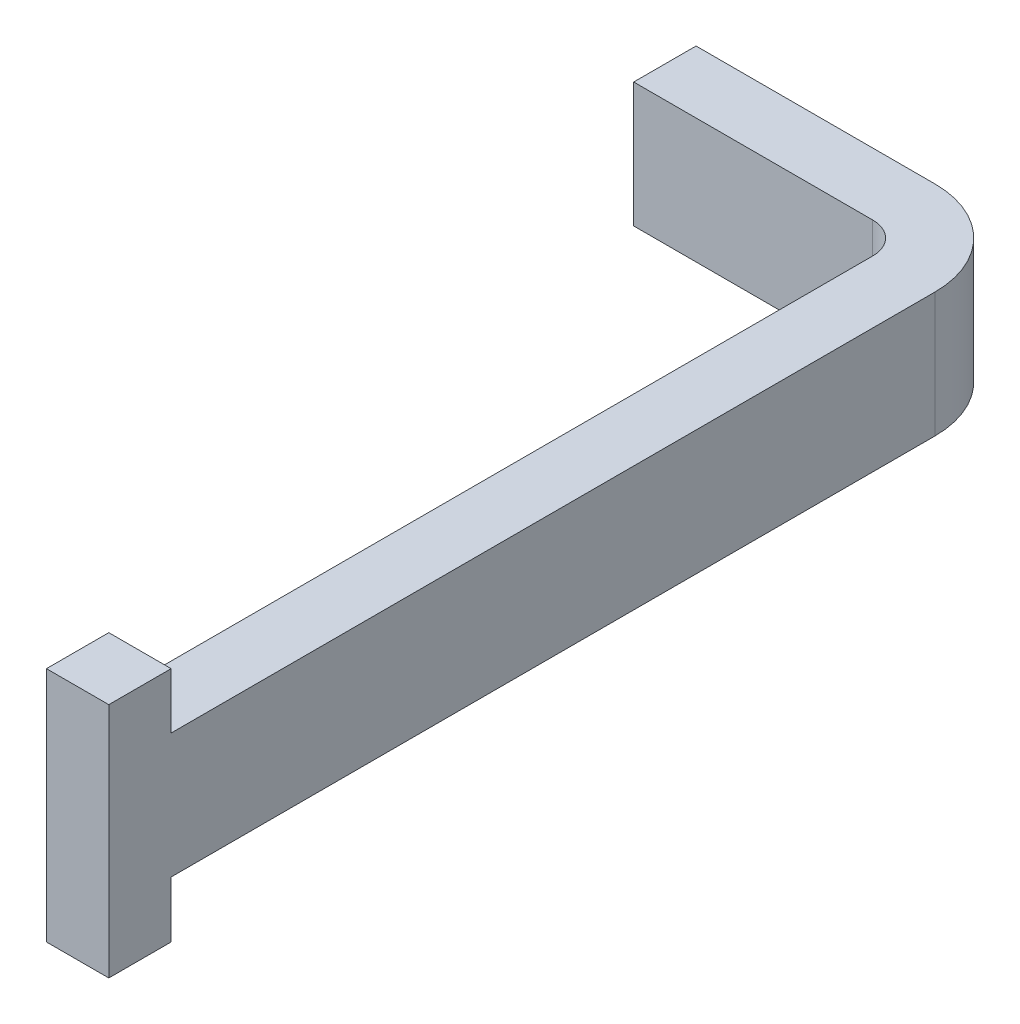
ISO-10303-21;
HEADER;
FILE_DESCRIPTION(('STEP AP214'),'2;1');
FILE_NAME('part.step','',(''),(''),'','','');
FILE_SCHEMA(('AUTOMOTIVE_DESIGN { 1 0 10303 214 1 1 1 1 }'));
ENDSEC;
DATA;
#1=APPLICATION_CONTEXT('core data for automotive mechanical design processes');
#2=APPLICATION_PROTOCOL_DEFINITION('international standard','automotive_design',2000,#1);
#3=PRODUCT_CONTEXT('',#1,'mechanical');
#4=PRODUCT('Part','Part','',(#3));
#5=PRODUCT_RELATED_PRODUCT_CATEGORY('part','',(#4));
#6=PRODUCT_DEFINITION_FORMATION('','',#4);
#7=PRODUCT_DEFINITION_CONTEXT('part definition',#1,'design');
#8=PRODUCT_DEFINITION('design','',#6,#7);
#9=PRODUCT_DEFINITION_SHAPE('','',#8);
#10=(LENGTH_UNIT() NAMED_UNIT(*) SI_UNIT(.MILLI.,.METRE.));
#11=(NAMED_UNIT(*) PLANE_ANGLE_UNIT() SI_UNIT($,.RADIAN.));
#12=(NAMED_UNIT(*) SI_UNIT($,.STERADIAN.) SOLID_ANGLE_UNIT());
#13=UNCERTAINTY_MEASURE_WITH_UNIT(LENGTH_MEASURE(1.E-05),#10,'distance_accuracy_value','');
#14=(GEOMETRIC_REPRESENTATION_CONTEXT(3) GLOBAL_UNCERTAINTY_ASSIGNED_CONTEXT((#13)) GLOBAL_UNIT_ASSIGNED_CONTEXT((#10,
#11,#12)) REPRESENTATION_CONTEXT('',''));
#15=CARTESIAN_POINT('',(0.,0.,0.));
#16=DIRECTION('',(0.,0.,1.));
#17=DIRECTION('',(1.,0.,0.));
#18=AXIS2_PLACEMENT_3D('',#15,#16,#17);
#19=CARTESIAN_POINT('',(-2.66645064696626,3.46679955703211,0.));
#20=DIRECTION('',(1.,0.,0.));
#21=DIRECTION('',(0.,1.,0.));
#22=AXIS2_PLACEMENT_3D('',#19,#20,#21);
#23=PLANE('',#22);
#24=DIRECTION('',(0.,0.,-1.));
#25=VECTOR('',#24,1.);
#26=CARTESIAN_POINT('',(-2.66645064696626,3.19594797890523,4.42580273563157));
#27=LINE('',#26,#25);
#28=CARTESIAN_POINT('',(-2.66645064696626,3.19594797890523,4.12580273563157));
#29=VERTEX_POINT('',#28);
#30=CARTESIAN_POINT('',(-2.66645064696626,3.19594797890523,4.42580273563157));
#31=VERTEX_POINT('',#30);
#32=EDGE_CURVE('E206',#29,#31,#27,.F.);
#33=ORIENTED_EDGE('',*,*,#32,.F.);
#34=DIRECTION('',(0.,1.,0.));
#35=VECTOR('',#34,1.);
#36=CARTESIAN_POINT('',(-2.66645064696626,3.46679955703211,4.12580273563157));
#37=LINE('',#36,#35);
#38=CARTESIAN_POINT('',(-2.66645064696626,3.46679955703211,4.12580273563157));
#39=VERTEX_POINT('',#38);
#40=EDGE_CURVE('E196',#39,#29,#37,.F.);
#41=ORIENTED_EDGE('',*,*,#40,.F.);
#42=DIRECTION('',(0.,0.,-1.));
#43=VECTOR('',#42,1.);
#44=CARTESIAN_POINT('',(-2.66645064696626,3.46679955703211,4.12580273563157));
#45=LINE('',#44,#43);
#46=CARTESIAN_POINT('',(-2.66645064696626,3.46679955703211,0.450000000000026));
#47=VERTEX_POINT('',#46);
#48=EDGE_CURVE('E178',#47,#39,#45,.F.);
#49=ORIENTED_EDGE('',*,*,#48,.F.);
#50=DIRECTION('',(0.,-1.,0.));
#51=VECTOR('',#50,1.);
#52=CARTESIAN_POINT('',(-2.66645064696626,4.06679955703211,0.450000000000026));
#53=LINE('',#52,#51);
#54=CARTESIAN_POINT('',(-2.66645064696626,4.06679955703211,0.450000000000026));
#55=VERTEX_POINT('',#54);
#56=EDGE_CURVE('E242',#55,#47,#53,.T.);
#57=ORIENTED_EDGE('',*,*,#56,.F.);
#58=DIRECTION('',(0.,0.,1.));
#59=VECTOR('',#58,1.);
#60=CARTESIAN_POINT('',(-2.66645064696626,4.06679955703211,4.12580273563157));
#61=LINE('',#60,#59);
#62=CARTESIAN_POINT('',(-2.66645064696626,4.06679955703211,4.12580273563157));
#63=VERTEX_POINT('',#62);
#64=EDGE_CURVE('E148',#63,#55,#61,.F.);
#65=ORIENTED_EDGE('',*,*,#64,.F.);
#66=DIRECTION('',(0.,1.,0.));
#67=VECTOR('',#66,1.);
#68=CARTESIAN_POINT('',(-2.66645064696626,4.33505285325489,4.12580273563157));
#69=LINE('',#68,#67);
#70=CARTESIAN_POINT('',(-2.66645064696626,4.33505285325489,4.12580273563157));
#71=VERTEX_POINT('',#70);
#72=EDGE_CURVE('E227',#71,#63,#69,.F.);
#73=ORIENTED_EDGE('',*,*,#72,.F.);
#74=DIRECTION('',(0.,0.,1.));
#75=VECTOR('',#74,1.);
#76=CARTESIAN_POINT('',(-2.66645064696626,4.33505285325489,4.42580273563157));
#77=LINE('',#76,#75);
#78=CARTESIAN_POINT('',(-2.66645064696626,4.33505285325489,4.42580273563157));
#79=VERTEX_POINT('',#78);
#80=EDGE_CURVE('E224',#79,#71,#77,.F.);
#81=ORIENTED_EDGE('',*,*,#80,.F.);
#82=DIRECTION('',(0.,1.,0.));
#83=VECTOR('',#82,1.);
#84=CARTESIAN_POINT('',(-2.66645064696626,4.33505285325489,4.42580273563157));
#85=LINE('',#84,#83);
#86=EDGE_CURVE('E215',#31,#79,#85,.T.);
#87=ORIENTED_EDGE('',*,*,#86,.F.);
#88=EDGE_LOOP('',(#33,#41,#49,#57,#65,#73,#81,#87));
#89=FACE_BOUND('',#88,.T.);
#90=ADVANCED_FACE('F17',(#89),#23,.T.);
#91=CARTESIAN_POINT('',(-3.11645064696626,4.06679955703211,0.450000000000026));
#92=DIRECTION('',(0.,-1.,0.));
#93=DIRECTION('',(1.,0.,0.));
#94=AXIS2_PLACEMENT_3D('',#91,#92,#93);
#95=CYLINDRICAL_SURFACE('',#94,0.45);
#96=CARTESIAN_POINT('',(-3.11645064696626,3.46679955703211,0.450000000000026));
#97=DIRECTION('',(0.,-1.,0.));
#98=DIRECTION('',(1.,0.,0.));
#99=AXIS2_PLACEMENT_3D('',#96,#97,#98);
#100=CIRCLE('',#99,0.45);
#101=CARTESIAN_POINT('',(-3.11645064696626,3.46679955703211,0.));
#102=VERTEX_POINT('',#101);
#103=EDGE_CURVE('E20',#102,#47,#100,.T.);
#104=ORIENTED_EDGE('',*,*,#103,.F.);
#105=DIRECTION('',(0.,1.,0.));
#106=VECTOR('',#105,1.);
#107=CARTESIAN_POINT('',(-3.11645064696626,4.06679955703211,0.));
#108=LINE('',#107,#106);
#109=CARTESIAN_POINT('',(-3.11645064696626,4.06679955703211,0.));
#110=VERTEX_POINT('',#109);
#111=EDGE_CURVE('E61',#110,#102,#108,.F.);
#112=ORIENTED_EDGE('',*,*,#111,.F.);
#113=CARTESIAN_POINT('',(-3.11645064696626,4.06679955703211,0.450000000000026));
#114=DIRECTION('',(0.,-1.,0.));
#115=DIRECTION('',(1.,0.,0.));
#116=AXIS2_PLACEMENT_3D('',#113,#114,#115);
#117=CIRCLE('',#116,0.45);
#118=EDGE_CURVE('E146',#55,#110,#117,.F.);
#119=ORIENTED_EDGE('',*,*,#118,.F.);
#120=ORIENTED_EDGE('',*,*,#56,.T.);
#121=EDGE_LOOP('',(#104,#112,#119,#120));
#122=FACE_BOUND('',#121,.T.);
#123=ADVANCED_FACE('F287',(#122),#95,.T.);
#124=CARTESIAN_POINT('',(-2.66645064696626,4.06679955703211,0.));
#125=DIRECTION('',(0.,0.,-1.));
#126=DIRECTION('',(0.,1.,0.));
#127=AXIS2_PLACEMENT_3D('',#124,#125,#126);
#128=PLANE('',#127);
#129=DIRECTION('',(1.,0.,0.));
#130=VECTOR('',#129,1.);
#131=CARTESIAN_POINT('',(-2.66645064696626,3.46679955703211,0.));
#132=LINE('',#131,#130);
#133=CARTESIAN_POINT('',(-4.26645064696626,3.46679955703211,0.));
#134=VERTEX_POINT('',#133);
#135=EDGE_CURVE('E182',#134,#102,#132,.T.);
#136=ORIENTED_EDGE('',*,*,#135,.F.);
#137=DIRECTION('',(0.,1.,0.));
#138=VECTOR('',#137,1.);
#139=CARTESIAN_POINT('',(-4.26645064696626,3.46679955703211,0.));
#140=LINE('',#139,#138);
#141=CARTESIAN_POINT('',(-4.26645064696626,4.06679955703211,0.));
#142=VERTEX_POINT('',#141);
#143=EDGE_CURVE('E71',#134,#142,#140,.T.);
#144=ORIENTED_EDGE('',*,*,#143,.T.);
#145=DIRECTION('',(1.,0.,0.));
#146=VECTOR('',#145,1.);
#147=CARTESIAN_POINT('',(-2.66645064696626,4.06679955703211,0.));
#148=LINE('',#147,#146);
#149=EDGE_CURVE('E147',#110,#142,#148,.F.);
#150=ORIENTED_EDGE('',*,*,#149,.F.);
#151=ORIENTED_EDGE('',*,*,#111,.T.);
#152=EDGE_LOOP('',(#136,#144,#150,#151));
#153=FACE_BOUND('',#152,.T.);
#154=ADVANCED_FACE('F288',(#153),#128,.T.);
#155=CARTESIAN_POINT('',(-4.26645064696626,3.46679955703211,0.3));
#156=DIRECTION('',(1.,0.,0.));
#157=DIRECTION('',(0.,0.,-1.));
#158=AXIS2_PLACEMENT_3D('',#155,#156,#157);
#159=PLANE('',#158);
#160=DIRECTION('',(0.,0.,1.));
#161=VECTOR('',#160,1.);
#162=CARTESIAN_POINT('',(-4.26645064696626,4.06679955703211,4.12580273563157));
#163=LINE('',#162,#161);
#164=CARTESIAN_POINT('',(-4.26645064696626,4.06679955703211,0.3));
#165=VERTEX_POINT('',#164);
#166=EDGE_CURVE('E121',#142,#165,#163,.T.);
#167=ORIENTED_EDGE('',*,*,#166,.F.);
#168=ORIENTED_EDGE('',*,*,#143,.F.);
#169=DIRECTION('',(0.,0.,-1.));
#170=VECTOR('',#169,1.);
#171=CARTESIAN_POINT('',(-4.26645064696626,3.46679955703211,4.12580273563157));
#172=LINE('',#171,#170);
#173=CARTESIAN_POINT('',(-4.26645064696626,3.46679955703211,0.3));
#174=VERTEX_POINT('',#173);
#175=EDGE_CURVE('E133',#174,#134,#172,.T.);
#176=ORIENTED_EDGE('',*,*,#175,.F.);
#177=DIRECTION('',(0.,1.,0.));
#178=VECTOR('',#177,1.);
#179=CARTESIAN_POINT('',(-4.26645064696626,4.06679955703211,0.3));
#180=LINE('',#179,#178);
#181=EDGE_CURVE('E229',#174,#165,#180,.T.);
#182=ORIENTED_EDGE('',*,*,#181,.T.);
#183=EDGE_LOOP('',(#167,#168,#176,#182));
#184=FACE_BOUND('',#183,.T.);
#185=ADVANCED_FACE('F289',(#184),#159,.F.);
#186=CARTESIAN_POINT('',(-4.26645064696626,4.06679955703211,0.3));
#187=DIRECTION('',(0.,0.,-1.));
#188=DIRECTION('',(-1.,0.,0.));
#189=AXIS2_PLACEMENT_3D('',#186,#187,#188);
#190=PLANE('',#189);
#191=DIRECTION('',(0.,-1.,0.));
#192=VECTOR('',#191,1.);
#193=CARTESIAN_POINT('',(-3.11645064696626,4.06679955703211,0.3));
#194=LINE('',#193,#192);
#195=CARTESIAN_POINT('',(-3.11645064696626,3.46679955703211,0.3));
#196=VERTEX_POINT('',#195);
#197=CARTESIAN_POINT('',(-3.11645064696626,4.06679955703211,0.3));
#198=VERTEX_POINT('',#197);
#199=EDGE_CURVE('E126',#196,#198,#194,.F.);
#200=ORIENTED_EDGE('',*,*,#199,.T.);
#201=DIRECTION('',(1.,0.,0.));
#202=VECTOR('',#201,1.);
#203=CARTESIAN_POINT('',(-2.66645064696626,4.06679955703211,0.3));
#204=LINE('',#203,#202);
#205=EDGE_CURVE('E118',#165,#198,#204,.T.);
#206=ORIENTED_EDGE('',*,*,#205,.F.);
#207=ORIENTED_EDGE('',*,*,#181,.F.);
#208=DIRECTION('',(1.,0.,0.));
#209=VECTOR('',#208,1.);
#210=CARTESIAN_POINT('',(-2.66645064696626,3.46679955703211,0.3));
#211=LINE('',#210,#209);
#212=EDGE_CURVE('E129',#196,#174,#211,.F.);
#213=ORIENTED_EDGE('',*,*,#212,.F.);
#214=EDGE_LOOP('',(#200,#206,#207,#213));
#215=FACE_BOUND('',#214,.T.);
#216=ADVANCED_FACE('F127',(#215),#190,.F.);
#217=CARTESIAN_POINT('',(-2.66645064696626,4.33505285325489,4.12580273563157));
#218=DIRECTION('',(0.,0.,-1.));
#219=DIRECTION('',(-1.,0.,0.));
#220=AXIS2_PLACEMENT_3D('',#217,#218,#219);
#221=PLANE('',#220);
#222=ORIENTED_EDGE('',*,*,#72,.T.);
#223=DIRECTION('',(1.,0.,0.));
#224=VECTOR('',#223,1.);
#225=CARTESIAN_POINT('',(-2.66645064696626,4.06679955703211,4.12580273563157));
#226=LINE('',#225,#224);
#227=CARTESIAN_POINT('',(-2.96645064696626,4.06679955703211,4.12580273563157));
#228=VERTEX_POINT('',#227);
#229=EDGE_CURVE('E138',#228,#63,#226,.T.);
#230=ORIENTED_EDGE('',*,*,#229,.F.);
#231=DIRECTION('',(0.,1.,0.));
#232=VECTOR('',#231,1.);
#233=CARTESIAN_POINT('',(-2.96645064696626,3.46679955703211,4.12580273563157));
#234=LINE('',#233,#232);
#235=CARTESIAN_POINT('',(-2.96645064696626,4.33505285325489,4.12580273563157));
#236=VERTEX_POINT('',#235);
#237=EDGE_CURVE('E115',#228,#236,#234,.T.);
#238=ORIENTED_EDGE('',*,*,#237,.T.);
#239=DIRECTION('',(-1.,0.,0.));
#240=VECTOR('',#239,1.);
#241=CARTESIAN_POINT('',(-2.66645064696626,4.33505285325489,4.12580273563157));
#242=LINE('',#241,#240);
#243=EDGE_CURVE('E222',#71,#236,#242,.T.);
#244=ORIENTED_EDGE('',*,*,#243,.F.);
#245=EDGE_LOOP('',(#222,#230,#238,#244));
#246=FACE_BOUND('',#245,.T.);
#247=ADVANCED_FACE('F265',(#246),#221,.T.);
#248=CARTESIAN_POINT('',(-2.66645064696626,4.33505285325489,4.42580273563157));
#249=DIRECTION('',(0.,1.,0.));
#250=DIRECTION('',(-1.,0.,0.));
#251=AXIS2_PLACEMENT_3D('',#248,#249,#250);
#252=PLANE('',#251);
#253=ORIENTED_EDGE('',*,*,#80,.T.);
#254=ORIENTED_EDGE('',*,*,#243,.T.);
#255=DIRECTION('',(0.,0.,1.));
#256=VECTOR('',#255,1.);
#257=CARTESIAN_POINT('',(-2.96645064696626,4.33505285325489,0.));
#258=LINE('',#257,#256);
#259=CARTESIAN_POINT('',(-2.96645064696626,4.33505285325489,4.42580273563157));
#260=VERTEX_POINT('',#259);
#261=EDGE_CURVE('E167',#236,#260,#258,.T.);
#262=ORIENTED_EDGE('',*,*,#261,.T.);
#263=DIRECTION('',(1.,0.,0.));
#264=VECTOR('',#263,1.);
#265=CARTESIAN_POINT('',(-2.66645064696626,4.33505285325489,4.42580273563157));
#266=LINE('',#265,#264);
#267=EDGE_CURVE('E213',#79,#260,#266,.F.);
#268=ORIENTED_EDGE('',*,*,#267,.F.);
#269=EDGE_LOOP('',(#253,#254,#262,#268));
#270=FACE_BOUND('',#269,.T.);
#271=ADVANCED_FACE('F259',(#270),#252,.T.);
#272=CARTESIAN_POINT('',(-2.66645064696626,4.33505285325489,4.42580273563157));
#273=DIRECTION('',(0.,0.,1.));
#274=DIRECTION('',(1.,0.,0.));
#275=AXIS2_PLACEMENT_3D('',#272,#273,#274);
#276=PLANE('',#275);
#277=ORIENTED_EDGE('',*,*,#86,.T.);
#278=ORIENTED_EDGE('',*,*,#267,.T.);
#279=DIRECTION('',(0.,1.,0.));
#280=VECTOR('',#279,1.);
#281=CARTESIAN_POINT('',(-2.96645064696626,3.46679955703211,4.42580273563157));
#282=LINE('',#281,#280);
#283=CARTESIAN_POINT('',(-2.96645064696626,3.19594797890523,4.42580273563157));
#284=VERTEX_POINT('',#283);
#285=EDGE_CURVE('E201',#260,#284,#282,.F.);
#286=ORIENTED_EDGE('',*,*,#285,.T.);
#287=DIRECTION('',(1.,0.,0.));
#288=VECTOR('',#287,1.);
#289=CARTESIAN_POINT('',(-2.66645064696626,3.19594797890523,4.42580273563157));
#290=LINE('',#289,#288);
#291=EDGE_CURVE('E204',#31,#284,#290,.F.);
#292=ORIENTED_EDGE('',*,*,#291,.F.);
#293=EDGE_LOOP('',(#277,#278,#286,#292));
#294=FACE_BOUND('',#293,.T.);
#295=ADVANCED_FACE('F283',(#294),#276,.T.);
#296=CARTESIAN_POINT('',(-2.66645064696626,3.19594797890523,4.42580273563157));
#297=DIRECTION('',(0.,-1.,0.));
#298=DIRECTION('',(0.,0.,-1.));
#299=AXIS2_PLACEMENT_3D('',#296,#297,#298);
#300=PLANE('',#299);
#301=ORIENTED_EDGE('',*,*,#32,.T.);
#302=ORIENTED_EDGE('',*,*,#291,.T.);
#303=DIRECTION('',(0.,0.,1.));
#304=VECTOR('',#303,1.);
#305=CARTESIAN_POINT('',(-2.96645064696626,3.19594797890523,0.));
#306=LINE('',#305,#304);
#307=CARTESIAN_POINT('',(-2.96645064696626,3.19594797890523,4.12580273563157));
#308=VERTEX_POINT('',#307);
#309=EDGE_CURVE('E192',#284,#308,#306,.F.);
#310=ORIENTED_EDGE('',*,*,#309,.T.);
#311=DIRECTION('',(-1.,0.,0.));
#312=VECTOR('',#311,1.);
#313=CARTESIAN_POINT('',(-2.66645064696626,3.19594797890523,4.12580273563157));
#314=LINE('',#313,#312);
#315=EDGE_CURVE('E184',#29,#308,#314,.T.);
#316=ORIENTED_EDGE('',*,*,#315,.F.);
#317=EDGE_LOOP('',(#301,#302,#310,#316));
#318=FACE_BOUND('',#317,.T.);
#319=ADVANCED_FACE('F280',(#318),#300,.T.);
#320=CARTESIAN_POINT('',(-2.66645064696626,3.46679955703211,4.12580273563157));
#321=DIRECTION('',(0.,0.,-1.));
#322=DIRECTION('',(-1.,0.,0.));
#323=AXIS2_PLACEMENT_3D('',#320,#321,#322);
#324=PLANE('',#323);
#325=ORIENTED_EDGE('',*,*,#40,.T.);
#326=ORIENTED_EDGE('',*,*,#315,.T.);
#327=DIRECTION('',(0.,1.,0.));
#328=VECTOR('',#327,1.);
#329=CARTESIAN_POINT('',(-2.96645064696626,3.46679955703211,4.12580273563157));
#330=LINE('',#329,#328);
#331=CARTESIAN_POINT('',(-2.96645064696626,3.46679955703211,4.12580273563157));
#332=VERTEX_POINT('',#331);
#333=EDGE_CURVE('E171',#308,#332,#330,.T.);
#334=ORIENTED_EDGE('',*,*,#333,.T.);
#335=DIRECTION('',(1.,0.,0.));
#336=VECTOR('',#335,1.);
#337=CARTESIAN_POINT('',(-2.66645064696626,3.46679955703211,4.12580273563157));
#338=LINE('',#337,#336);
#339=EDGE_CURVE('E175',#39,#332,#338,.F.);
#340=ORIENTED_EDGE('',*,*,#339,.F.);
#341=EDGE_LOOP('',(#325,#326,#334,#340));
#342=FACE_BOUND('',#341,.T.);
#343=ADVANCED_FACE('F275',(#342),#324,.T.);
#344=CARTESIAN_POINT('',(-2.66645064696626,3.46679955703211,4.12580273563157));
#345=DIRECTION('',(0.,-1.,0.));
#346=DIRECTION('',(0.,0.,-1.));
#347=AXIS2_PLACEMENT_3D('',#344,#345,#346);
#348=PLANE('',#347);
#349=ORIENTED_EDGE('',*,*,#212,.T.);
#350=ORIENTED_EDGE('',*,*,#175,.T.);
#351=ORIENTED_EDGE('',*,*,#135,.T.);
#352=ORIENTED_EDGE('',*,*,#103,.T.);
#353=ORIENTED_EDGE('',*,*,#48,.T.);
#354=ORIENTED_EDGE('',*,*,#339,.T.);
#355=DIRECTION('',(0.,0.,1.));
#356=VECTOR('',#355,1.);
#357=CARTESIAN_POINT('',(-2.96645064696626,3.46679955703211,0.));
#358=LINE('',#357,#356);
#359=CARTESIAN_POINT('',(-2.96645064696626,3.46679955703211,0.45));
#360=VERTEX_POINT('',#359);
#361=EDGE_CURVE('E160',#332,#360,#358,.F.);
#362=ORIENTED_EDGE('',*,*,#361,.T.);
#363=CARTESIAN_POINT('',(-3.11645064696626,3.46679955703211,0.45));
#364=DIRECTION('',(0.,-1.,0.));
#365=DIRECTION('',(1.,0.,0.));
#366=AXIS2_PLACEMENT_3D('',#363,#364,#365);
#367=CIRCLE('',#366,0.15);
#368=EDGE_CURVE('E132',#360,#196,#367,.F.);
#369=ORIENTED_EDGE('',*,*,#368,.T.);
#370=EDGE_LOOP('',(#349,#350,#351,#352,#353,#354,#362,#369));
#371=FACE_BOUND('',#370,.T.);
#372=ADVANCED_FACE('F269',(#371),#348,.T.);
#373=CARTESIAN_POINT('',(-3.11645064696626,4.06679955703211,0.45));
#374=DIRECTION('',(0.,-1.,0.));
#375=DIRECTION('',(1.,0.,0.));
#376=AXIS2_PLACEMENT_3D('',#373,#374,#375);
#377=CYLINDRICAL_SURFACE('',#376,0.15);
#378=DIRECTION('',(0.,1.,0.));
#379=VECTOR('',#378,1.);
#380=CARTESIAN_POINT('',(-2.96645064696626,3.46679955703211,0.45));
#381=LINE('',#380,#379);
#382=CARTESIAN_POINT('',(-2.96645064696626,4.06679955703211,0.45));
#383=VERTEX_POINT('',#382);
#384=EDGE_CURVE('E26',#360,#383,#381,.T.);
#385=ORIENTED_EDGE('',*,*,#384,.T.);
#386=CARTESIAN_POINT('',(-3.11645064696626,4.06679955703211,0.45));
#387=DIRECTION('',(0.,-1.,0.));
#388=DIRECTION('',(1.,0.,0.));
#389=AXIS2_PLACEMENT_3D('',#386,#387,#388);
#390=CIRCLE('',#389,0.15);
#391=EDGE_CURVE('E34',#198,#383,#390,.T.);
#392=ORIENTED_EDGE('',*,*,#391,.F.);
#393=ORIENTED_EDGE('',*,*,#199,.F.);
#394=ORIENTED_EDGE('',*,*,#368,.F.);
#395=EDGE_LOOP('',(#385,#392,#393,#394));
#396=FACE_BOUND('',#395,.T.);
#397=ADVANCED_FACE('F136',(#396),#377,.F.);
#398=CARTESIAN_POINT('',(-2.66645064696626,4.06679955703211,4.12580273563157));
#399=DIRECTION('',(0.,1.,0.));
#400=DIRECTION('',(0.,0.,1.));
#401=AXIS2_PLACEMENT_3D('',#398,#399,#400);
#402=PLANE('',#401);
#403=DIRECTION('',(0.,0.,1.));
#404=VECTOR('',#403,1.);
#405=CARTESIAN_POINT('',(-2.96645064696626,4.06679955703211,0.));
#406=LINE('',#405,#404);
#407=EDGE_CURVE('E11',#383,#228,#406,.T.);
#408=ORIENTED_EDGE('',*,*,#407,.T.);
#409=ORIENTED_EDGE('',*,*,#229,.T.);
#410=ORIENTED_EDGE('',*,*,#64,.T.);
#411=ORIENTED_EDGE('',*,*,#118,.T.);
#412=ORIENTED_EDGE('',*,*,#149,.T.);
#413=ORIENTED_EDGE('',*,*,#166,.T.);
#414=ORIENTED_EDGE('',*,*,#205,.T.);
#415=ORIENTED_EDGE('',*,*,#391,.T.);
#416=EDGE_LOOP('',(#408,#409,#410,#411,#412,#413,#414,#415));
#417=FACE_BOUND('',#416,.T.);
#418=ADVANCED_FACE('F120',(#417),#402,.T.);
#419=CARTESIAN_POINT('',(-2.96645064696626,3.46679955703211,0.));
#420=DIRECTION('',(1.,0.,0.));
#421=DIRECTION('',(0.,1.,0.));
#422=AXIS2_PLACEMENT_3D('',#419,#420,#421);
#423=PLANE('',#422);
#424=ORIENTED_EDGE('',*,*,#384,.F.);
#425=ORIENTED_EDGE('',*,*,#361,.F.);
#426=ORIENTED_EDGE('',*,*,#333,.F.);
#427=ORIENTED_EDGE('',*,*,#309,.F.);
#428=ORIENTED_EDGE('',*,*,#285,.F.);
#429=ORIENTED_EDGE('',*,*,#261,.F.);
#430=ORIENTED_EDGE('',*,*,#237,.F.);
#431=ORIENTED_EDGE('',*,*,#407,.F.);
#432=EDGE_LOOP('',(#424,#425,#426,#427,#428,#429,#430,#431));
#433=FACE_BOUND('',#432,.T.);
#434=ADVANCED_FACE('F266',(#433),#423,.F.);
#435=CLOSED_SHELL('',(#90,#123,#154,#185,#216,#247,#271,#295,#319,#343,#372,#397,#418,#434));
#436=MANIFOLD_SOLID_BREP('B1',#435);
#437=ADVANCED_BREP_SHAPE_REPRESENTATION('',(#18,#436),#14);
#438=SHAPE_DEFINITION_REPRESENTATION(#9,#437);
ENDSEC;
END-ISO-10303-21;
